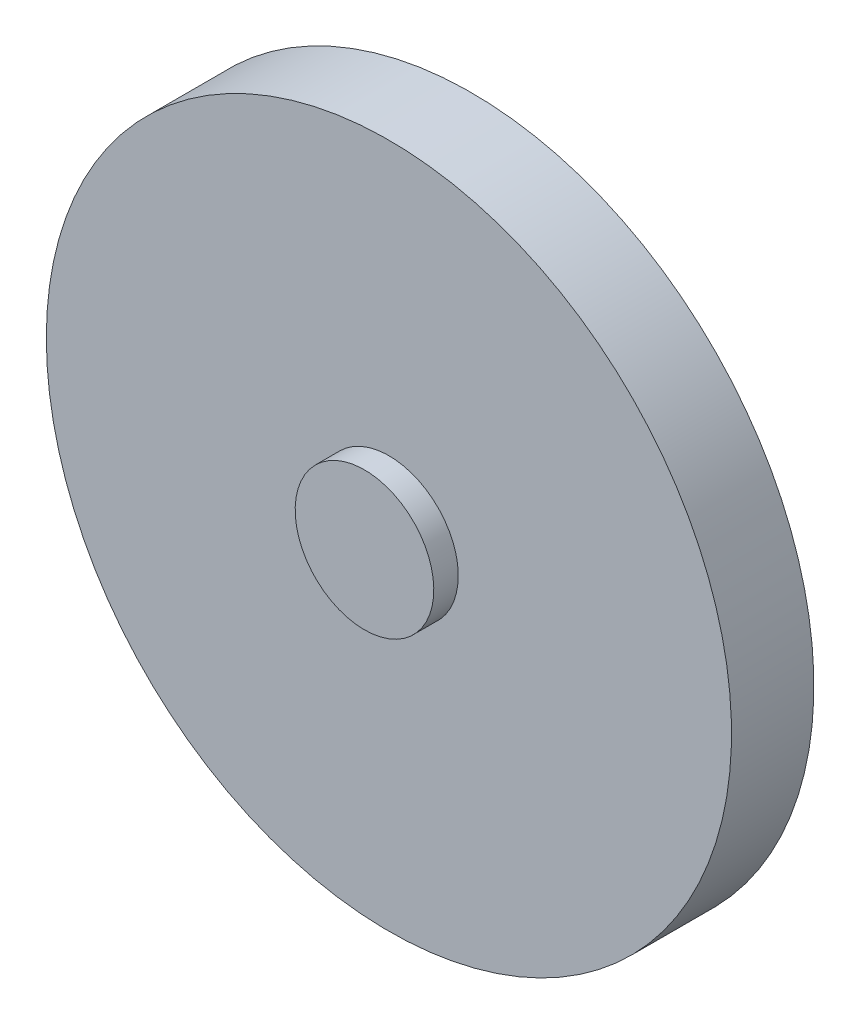
ISO-10303-21;
HEADER;
FILE_DESCRIPTION(('STEP AP214'),'2;1');
FILE_NAME('part.step','',(''),(''),'','','');
FILE_SCHEMA(('AUTOMOTIVE_DESIGN { 1 0 10303 214 1 1 1 1 }'));
ENDSEC;
DATA;
#1=APPLICATION_CONTEXT('core data for automotive mechanical design processes');
#2=APPLICATION_PROTOCOL_DEFINITION('international standard','automotive_design',2000,#1);
#3=PRODUCT_CONTEXT('',#1,'mechanical');
#4=PRODUCT('Part','Part','',(#3));
#5=PRODUCT_RELATED_PRODUCT_CATEGORY('part','',(#4));
#6=PRODUCT_DEFINITION_FORMATION('','',#4);
#7=PRODUCT_DEFINITION_CONTEXT('part definition',#1,'design');
#8=PRODUCT_DEFINITION('design','',#6,#7);
#9=PRODUCT_DEFINITION_SHAPE('','',#8);
#10=(LENGTH_UNIT() NAMED_UNIT(*) SI_UNIT(.MILLI.,.METRE.));
#11=(NAMED_UNIT(*) PLANE_ANGLE_UNIT() SI_UNIT($,.RADIAN.));
#12=(NAMED_UNIT(*) SI_UNIT($,.STERADIAN.) SOLID_ANGLE_UNIT());
#13=UNCERTAINTY_MEASURE_WITH_UNIT(LENGTH_MEASURE(1.E-05),#10,'distance_accuracy_value','');
#14=(GEOMETRIC_REPRESENTATION_CONTEXT(3) GLOBAL_UNCERTAINTY_ASSIGNED_CONTEXT((#13)) GLOBAL_UNIT_ASSIGNED_CONTEXT((#10,
#11,#12)) REPRESENTATION_CONTEXT('',''));
#15=CARTESIAN_POINT('',(0.,0.,0.));
#16=DIRECTION('',(0.,0.,1.));
#17=DIRECTION('',(1.,0.,0.));
#18=AXIS2_PLACEMENT_3D('',#15,#16,#17);
#19=CARTESIAN_POINT('',(-77.2504091626865,123.55655672875,26.9113));
#20=DIRECTION('',(0.,0.,1.));
#21=DIRECTION('',(-0.963721085297018,-0.26691135186413,0.));
#22=AXIS2_PLACEMENT_3D('',#19,#20,#21);
#23=PLANE('',#22);
#24=CARTESIAN_POINT('',(-77.2504091626865,123.55655672875,26.9113));
#25=DIRECTION('',(0.,0.,-1.));
#26=DIRECTION('',(-0.963721085297018,-0.26691135186413,0.));
#27=AXIS2_PLACEMENT_3D('',#24,#25,#26);
#28=CIRCLE('',#27,6.6802);
#29=CARTESIAN_POINT('',(-83.6882587566876,121.773535516027,26.9113));
#30=VERTEX_POINT('',#29);
#31=EDGE_CURVE('E38',#30,#30,#28,.T.);
#32=ORIENTED_EDGE('',*,*,#31,.T.);
#33=EDGE_LOOP('',(#32));
#34=FACE_BOUND('',#33,.T.);
#35=ADVANCED_FACE('F15',(#34),#23,.F.);
#36=CARTESIAN_POINT('',(-77.2504091626865,123.55655672875,33.2359));
#37=DIRECTION('',(0.,0.,-1.));
#38=DIRECTION('',(0.963721085297018,0.26691135186413,0.));
#39=AXIS2_PLACEMENT_3D('',#36,#37,#38);
#40=CYLINDRICAL_SURFACE('',#39,6.6802);
#41=ORIENTED_EDGE('',*,*,#31,.F.);
#42=EDGE_LOOP('',(#41));
#43=FACE_BOUND('',#42,.T.);
#44=CARTESIAN_POINT('',(-77.2504091626865,123.55655672875,29.26715));
#45=DIRECTION('',(0.,0.,1.));
#46=DIRECTION('',(1.,0.,0.));
#47=AXIS2_PLACEMENT_3D('',#44,#45,#46);
#48=CIRCLE('',#47,6.6802);
#49=CARTESIAN_POINT('',(-70.5702091626865,123.55655672875,29.26715));
#50=VERTEX_POINT('',#49);
#51=EDGE_CURVE('E19',#50,#50,#48,.F.);
#52=ORIENTED_EDGE('',*,*,#51,.T.);
#53=EDGE_LOOP('',(#52));
#54=FACE_BOUND('',#53,.T.);
#55=ADVANCED_FACE('F17',(#43,#54),#40,.T.);
#56=CARTESIAN_POINT('',(-77.2504091626865,123.55655672875,37.20465));
#57=DIRECTION('',(0.,0.,1.));
#58=DIRECTION('',(-0.963721085297018,-0.26691135186413,0.));
#59=AXIS2_PLACEMENT_3D('',#56,#57,#58);
#60=PLANE('',#59);
#61=CARTESIAN_POINT('',(-77.2504091626865,123.55655672875,37.20465));
#62=DIRECTION('',(0.,0.,1.));
#63=DIRECTION('',(-0.963721085297018,-0.26691135186413,0.));
#64=AXIS2_PLACEMENT_3D('',#61,#62,#63);
#65=CIRCLE('',#64,33.02);
#66=CARTESIAN_POINT('',(-109.072479399194,114.743143890196,37.20465));
#67=VERTEX_POINT('',#66);
#68=EDGE_CURVE('E32',#67,#67,#65,.T.);
#69=ORIENTED_EDGE('',*,*,#68,.T.);
#70=EDGE_LOOP('',(#69));
#71=FACE_BOUND('',#70,.T.);
#72=CARTESIAN_POINT('',(-77.2504091626865,123.55655672875,37.20465));
#73=DIRECTION('',(0.,0.,1.));
#74=DIRECTION('',(1.,0.,0.));
#75=AXIS2_PLACEMENT_3D('',#72,#73,#74);
#76=CIRCLE('',#75,6.6802);
#77=CARTESIAN_POINT('',(-70.5702091626865,123.55655672875,37.20465));
#78=VERTEX_POINT('',#77);
#79=EDGE_CURVE('E10',#78,#78,#76,.F.);
#80=ORIENTED_EDGE('',*,*,#79,.T.);
#81=EDGE_LOOP('',(#80));
#82=FACE_BOUND('',#81,.T.);
#83=ADVANCED_FACE('F54',(#71,#82),#60,.T.);
#84=CARTESIAN_POINT('',(-77.2504091626865,123.55655672875,29.26715));
#85=DIRECTION('',(0.,0.,1.));
#86=DIRECTION('',(-0.963721085297018,-0.26691135186413,0.));
#87=AXIS2_PLACEMENT_3D('',#84,#85,#86);
#88=PLANE('',#87);
#89=CARTESIAN_POINT('',(-77.2504091626865,123.55655672875,29.26715));
#90=DIRECTION('',(0.,0.,1.));
#91=DIRECTION('',(-0.963721085297018,-0.26691135186413,0.));
#92=AXIS2_PLACEMENT_3D('',#89,#90,#91);
#93=CIRCLE('',#92,33.02);
#94=CARTESIAN_POINT('',(-109.072479399194,114.743143890196,29.26715));
#95=VERTEX_POINT('',#94);
#96=EDGE_CURVE('E24',#95,#95,#93,.T.);
#97=ORIENTED_EDGE('',*,*,#96,.F.);
#98=EDGE_LOOP('',(#97));
#99=FACE_BOUND('',#98,.T.);
#100=ORIENTED_EDGE('',*,*,#51,.F.);
#101=EDGE_LOOP('',(#100));
#102=FACE_BOUND('',#101,.T.);
#103=ADVANCED_FACE('F51',(#99,#102),#88,.F.);
#104=CARTESIAN_POINT('',(-77.2504091626865,123.55655672875,33.2359));
#105=DIRECTION('',(0.,0.,1.));
#106=DIRECTION('',(-0.963721085297018,-0.26691135186413,0.));
#107=AXIS2_PLACEMENT_3D('',#104,#105,#106);
#108=CYLINDRICAL_SURFACE('',#107,33.02);
#109=ORIENTED_EDGE('',*,*,#96,.T.);
#110=EDGE_LOOP('',(#109));
#111=FACE_BOUND('',#110,.T.);
#112=ORIENTED_EDGE('',*,*,#68,.F.);
#113=EDGE_LOOP('',(#112));
#114=FACE_BOUND('',#113,.T.);
#115=ADVANCED_FACE('F53',(#111,#114),#108,.T.);
#116=CARTESIAN_POINT('',(-77.2504091626865,123.55655672875,39.5605));
#117=DIRECTION('',(0.,0.,1.));
#118=DIRECTION('',(-0.963721085297018,-0.26691135186413,0.));
#119=AXIS2_PLACEMENT_3D('',#116,#117,#118);
#120=PLANE('',#119);
#121=CARTESIAN_POINT('',(-77.2504091626865,123.55655672875,39.5605));
#122=DIRECTION('',(0.,0.,-1.));
#123=DIRECTION('',(0.963721085297018,0.26691135186413,0.));
#124=AXIS2_PLACEMENT_3D('',#121,#122,#123);
#125=CIRCLE('',#124,6.6802);
#126=CARTESIAN_POINT('',(-70.8125595686854,125.339577941473,39.5605));
#127=VERTEX_POINT('',#126);
#128=EDGE_CURVE('E35',#127,#127,#125,.T.);
#129=ORIENTED_EDGE('',*,*,#128,.F.);
#130=EDGE_LOOP('',(#129));
#131=FACE_BOUND('',#130,.T.);
#132=ADVANCED_FACE('F61',(#131),#120,.T.);
#133=ORIENTED_EDGE('',*,*,#79,.F.);
#134=EDGE_LOOP('',(#133));
#135=FACE_BOUND('',#134,.T.);
#136=ORIENTED_EDGE('',*,*,#128,.T.);
#137=EDGE_LOOP('',(#136));
#138=FACE_BOUND('',#137,.T.);
#139=ADVANCED_FACE('F71',(#135,#138),#40,.T.);
#140=CLOSED_SHELL('',(#35,#55,#83,#103,#115,#132,#139));
#141=MANIFOLD_SOLID_BREP('B1',#140);
#142=ADVANCED_BREP_SHAPE_REPRESENTATION('',(#18,#141),#14);
#143=SHAPE_DEFINITION_REPRESENTATION(#9,#142);
ENDSEC;
END-ISO-10303-21;
